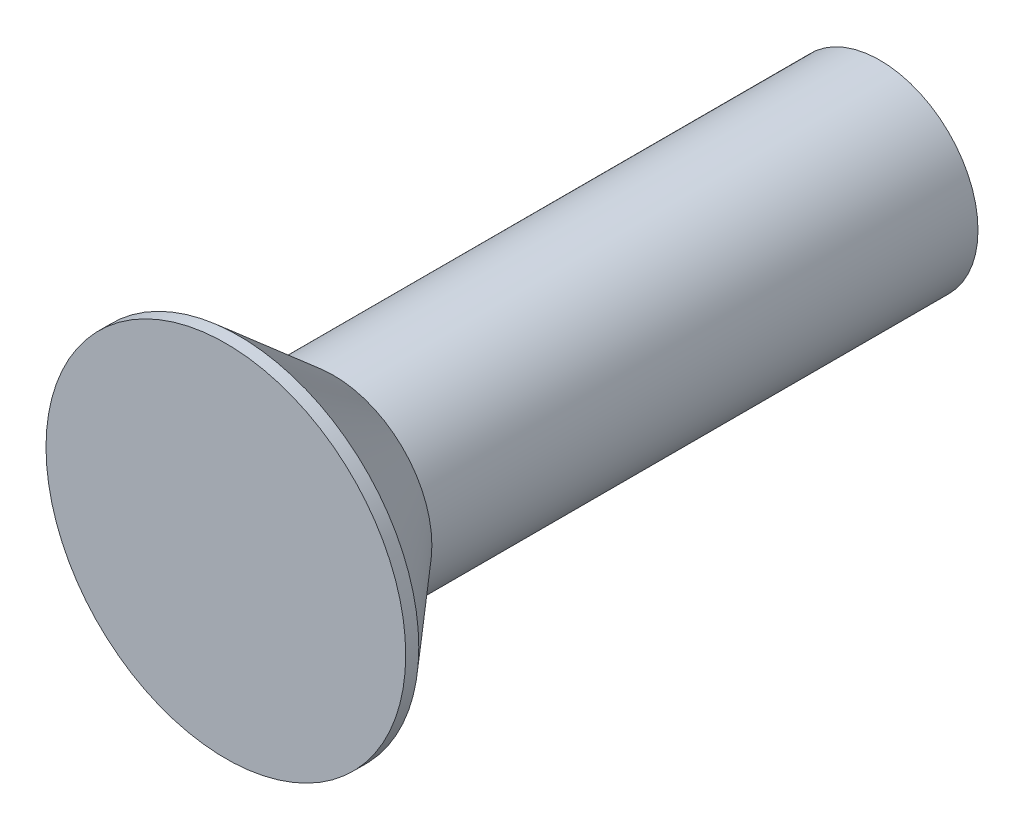
ISO-10303-21;
HEADER;
FILE_DESCRIPTION(('STEP AP214'),'2;1');
FILE_NAME('part.step','',(''),(''),'','','');
FILE_SCHEMA(('AUTOMOTIVE_DESIGN { 1 0 10303 214 1 1 1 1 }'));
ENDSEC;
DATA;
#1=APPLICATION_CONTEXT('core data for automotive mechanical design processes');
#2=APPLICATION_PROTOCOL_DEFINITION('international standard','automotive_design',2000,#1);
#3=PRODUCT_CONTEXT('',#1,'mechanical');
#4=PRODUCT('Part','Part','',(#3));
#5=PRODUCT_RELATED_PRODUCT_CATEGORY('part','',(#4));
#6=PRODUCT_DEFINITION_FORMATION('','',#4);
#7=PRODUCT_DEFINITION_CONTEXT('part definition',#1,'design');
#8=PRODUCT_DEFINITION('design','',#6,#7);
#9=PRODUCT_DEFINITION_SHAPE('','',#8);
#10=(LENGTH_UNIT() NAMED_UNIT(*) SI_UNIT(.MILLI.,.METRE.));
#11=(NAMED_UNIT(*) PLANE_ANGLE_UNIT() SI_UNIT($,.RADIAN.));
#12=(NAMED_UNIT(*) SI_UNIT($,.STERADIAN.) SOLID_ANGLE_UNIT());
#13=UNCERTAINTY_MEASURE_WITH_UNIT(LENGTH_MEASURE(1.E-05),#10,'distance_accuracy_value','');
#14=(GEOMETRIC_REPRESENTATION_CONTEXT(3) GLOBAL_UNCERTAINTY_ASSIGNED_CONTEXT((#13)) GLOBAL_UNIT_ASSIGNED_CONTEXT((#10,
#11,#12)) REPRESENTATION_CONTEXT('',''));
#15=CARTESIAN_POINT('',(0.,0.,0.));
#16=DIRECTION('',(0.,0.,1.));
#17=DIRECTION('',(1.,0.,0.));
#18=AXIS2_PLACEMENT_3D('',#15,#16,#17);
#19=CARTESIAN_POINT('',(0.,0.,-6.88754717671865));
#20=DIRECTION('',(0.,0.,1.));
#21=DIRECTION('',(1.,0.,0.));
#22=AXIS2_PLACEMENT_3D('',#19,#20,#21);
#23=PLANE('',#22);
#24=CARTESIAN_POINT('',(0.,0.,-6.88754717671865));
#25=DIRECTION('',(0.,0.,1.));
#26=DIRECTION('',(1.,0.,0.));
#27=AXIS2_PLACEMENT_3D('',#24,#25,#26);
#28=CIRCLE('',#27,1.5);
#29=CARTESIAN_POINT('',(1.5,0.,-6.88754717671865));
#30=VERTEX_POINT('',#29);
#31=EDGE_CURVE('E51',#30,#30,#28,.T.);
#32=ORIENTED_EDGE('',*,*,#31,.F.);
#33=EDGE_LOOP('',(#32));
#34=FACE_BOUND('',#33,.T.);
#35=ADVANCED_FACE('F37',(#34),#23,.F.);
#36=CARTESIAN_POINT('',(0.,0.,3.11245282328135));
#37=DIRECTION('',(0.,0.,-1.));
#38=DIRECTION('',(-1.,0.,0.));
#39=AXIS2_PLACEMENT_3D('',#36,#37,#38);
#40=PLANE('',#39);
#41=CARTESIAN_POINT('',(0.,0.,3.11245282328135));
#42=DIRECTION('',(0.,0.,1.));
#43=DIRECTION('',(1.,0.,0.));
#44=AXIS2_PLACEMENT_3D('',#41,#42,#43);
#45=CIRCLE('',#44,2.75);
#46=CARTESIAN_POINT('',(2.75,0.,3.11245282328135));
#47=VERTEX_POINT('',#46);
#48=EDGE_CURVE('E10',#47,#47,#45,.T.);
#49=ORIENTED_EDGE('',*,*,#48,.T.);
#50=EDGE_LOOP('',(#49));
#51=FACE_BOUND('',#50,.T.);
#52=ADVANCED_FACE('F60',(#51),#40,.F.);
#53=CARTESIAN_POINT('',(0.,0.,5.3523068096682));
#54=DIRECTION('',(0.,0.,1.));
#55=DIRECTION('',(1.,0.,0.));
#56=AXIS2_PLACEMENT_3D('',#53,#54,#55);
#57=CYLINDRICAL_SURFACE('',#56,2.75);
#58=ORIENTED_EDGE('',*,*,#48,.F.);
#59=EDGE_LOOP('',(#58));
#60=FACE_BOUND('',#59,.T.);
#61=CARTESIAN_POINT('',(0.,0.,2.91245282328135));
#62=DIRECTION('',(0.,0.,1.));
#63=DIRECTION('',(1.,0.,0.));
#64=AXIS2_PLACEMENT_3D('',#61,#62,#63);
#65=CIRCLE('',#64,2.75);
#66=CARTESIAN_POINT('',(2.75,0.,2.91245282328135));
#67=VERTEX_POINT('',#66);
#68=EDGE_CURVE('E43',#67,#67,#65,.T.);
#69=ORIENTED_EDGE('',*,*,#68,.T.);
#70=EDGE_LOOP('',(#69));
#71=FACE_BOUND('',#70,.T.);
#72=ADVANCED_FACE('F64',(#60,#71),#57,.T.);
#73=CARTESIAN_POINT('',(0.,0.,1.46245282328135));
#74=DIRECTION('',(0.,0.,1.));
#75=DIRECTION('',(1.,0.,0.));
#76=AXIS2_PLACEMENT_3D('',#73,#74,#75);
#77=CONICAL_SURFACE('',#76,1.5,0.711459125739508);
#78=ORIENTED_EDGE('',*,*,#68,.F.);
#79=EDGE_LOOP('',(#78));
#80=FACE_BOUND('',#79,.T.);
#81=CARTESIAN_POINT('',(0.,0.,1.46245282328135));
#82=DIRECTION('',(0.,0.,1.));
#83=DIRECTION('',(1.,0.,0.));
#84=AXIS2_PLACEMENT_3D('',#81,#82,#83);
#85=CIRCLE('',#84,1.5);
#86=CARTESIAN_POINT('',(1.5,0.,1.46245282328135));
#87=VERTEX_POINT('',#86);
#88=EDGE_CURVE('E47',#87,#87,#85,.T.);
#89=ORIENTED_EDGE('',*,*,#88,.T.);
#90=EDGE_LOOP('',(#89));
#91=FACE_BOUND('',#90,.T.);
#92=ADVANCED_FACE('F68',(#80,#91),#77,.T.);
#93=CARTESIAN_POINT('',(0.,0.,5.3523068096682));
#94=DIRECTION('',(0.,0.,1.));
#95=DIRECTION('',(1.,0.,0.));
#96=AXIS2_PLACEMENT_3D('',#93,#94,#95);
#97=CYLINDRICAL_SURFACE('',#96,1.5);
#98=ORIENTED_EDGE('',*,*,#88,.F.);
#99=EDGE_LOOP('',(#98));
#100=FACE_BOUND('',#99,.T.);
#101=ORIENTED_EDGE('',*,*,#31,.T.);
#102=EDGE_LOOP('',(#101));
#103=FACE_BOUND('',#102,.T.);
#104=ADVANCED_FACE('F57',(#100,#103),#97,.T.);
#105=CLOSED_SHELL('',(#35,#52,#72,#92,#104));
#106=MANIFOLD_SOLID_BREP('B2',#105);
#107=ADVANCED_BREP_SHAPE_REPRESENTATION('',(#18,#106),#14);
#108=SHAPE_DEFINITION_REPRESENTATION(#9,#107);
ENDSEC;
END-ISO-10303-21;
